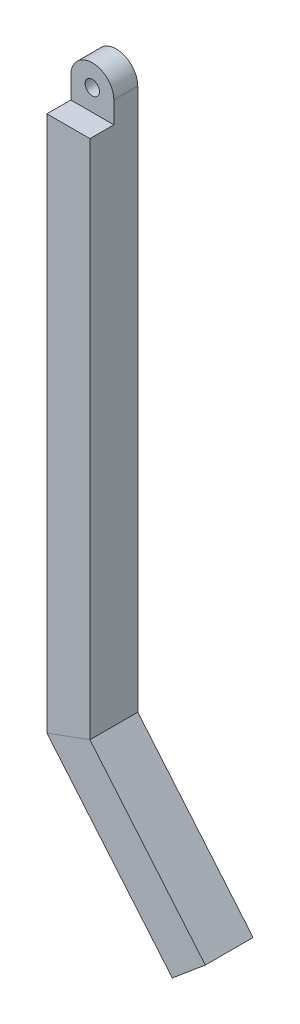
ISO-10303-21;
HEADER;
FILE_DESCRIPTION(('STEP AP214'),'2;1');
FILE_NAME('part.step','',(''),(''),'','','');
FILE_SCHEMA(('AUTOMOTIVE_DESIGN { 1 0 10303 214 1 1 1 1 }'));
ENDSEC;
DATA;
#1=APPLICATION_CONTEXT('core data for automotive mechanical design processes');
#2=APPLICATION_PROTOCOL_DEFINITION('international standard','automotive_design',2000,#1);
#3=PRODUCT_CONTEXT('',#1,'mechanical');
#4=PRODUCT('Part','Part','',(#3));
#5=PRODUCT_RELATED_PRODUCT_CATEGORY('part','',(#4));
#6=PRODUCT_DEFINITION_FORMATION('','',#4);
#7=PRODUCT_DEFINITION_CONTEXT('part definition',#1,'design');
#8=PRODUCT_DEFINITION('design','',#6,#7);
#9=PRODUCT_DEFINITION_SHAPE('','',#8);
#10=(LENGTH_UNIT() NAMED_UNIT(*) SI_UNIT(.MILLI.,.METRE.));
#11=(NAMED_UNIT(*) PLANE_ANGLE_UNIT() SI_UNIT($,.RADIAN.));
#12=(NAMED_UNIT(*) SI_UNIT($,.STERADIAN.) SOLID_ANGLE_UNIT());
#13=UNCERTAINTY_MEASURE_WITH_UNIT(LENGTH_MEASURE(1.E-05),#10,'distance_accuracy_value','');
#14=(GEOMETRIC_REPRESENTATION_CONTEXT(3) GLOBAL_UNCERTAINTY_ASSIGNED_CONTEXT((#13)) GLOBAL_UNIT_ASSIGNED_CONTEXT((#10,
#11,#12)) REPRESENTATION_CONTEXT('',''));
#15=CARTESIAN_POINT('',(0.,0.,0.));
#16=DIRECTION('',(0.,0.,1.));
#17=DIRECTION('',(1.,0.,0.));
#18=AXIS2_PLACEMENT_3D('',#15,#16,#17);
#19=CARTESIAN_POINT('',(-15.3,10.,-1.04285714285714));
#20=DIRECTION('',(-1.,0.,0.));
#21=DIRECTION('',(0.,0.,1.));
#22=AXIS2_PLACEMENT_3D('',#19,#20,#21);
#23=PLANE('',#22);
#24=DIRECTION('',(0.,0.,-1.));
#25=VECTOR('',#24,1.);
#26=CARTESIAN_POINT('',(-15.3,0.5,13.9571428571429));
#27=LINE('',#26,#25);
#28=CARTESIAN_POINT('',(-15.3,0.5,8.95714285714286));
#29=VERTEX_POINT('',#28);
#30=CARTESIAN_POINT('',(-15.3,0.5,3.95714285714286));
#31=VERTEX_POINT('',#30);
#32=EDGE_CURVE('E206',#29,#31,#27,.T.);
#33=ORIENTED_EDGE('',*,*,#32,.F.);
#34=DIRECTION('',(0.,-1.,0.));
#35=VECTOR('',#34,1.);
#36=CARTESIAN_POINT('',(-15.3,10.,8.95714285714286));
#37=LINE('',#36,#35);
#38=CARTESIAN_POINT('',(-15.3,-108.362133945802,8.95714285714286));
#39=VERTEX_POINT('',#38);
#40=EDGE_CURVE('E137',#29,#39,#37,.T.);
#41=ORIENTED_EDGE('',*,*,#40,.T.);
#42=DIRECTION('',(0.,0.,1.));
#43=VECTOR('',#42,1.);
#44=CARTESIAN_POINT('',(-15.3,-108.362133945802,-1.04285714285714));
#45=LINE('',#44,#43);
#46=CARTESIAN_POINT('',(-15.3,-108.362133945802,-1.04285714285714));
#47=VERTEX_POINT('',#46);
#48=EDGE_CURVE('E173',#47,#39,#45,.T.);
#49=ORIENTED_EDGE('',*,*,#48,.F.);
#50=DIRECTION('',(0.,-1.,0.));
#51=VECTOR('',#50,1.);
#52=CARTESIAN_POINT('',(-15.3,10.,-1.04285714285714));
#53=LINE('',#52,#51);
#54=CARTESIAN_POINT('',(-15.3,5.,-1.04285714285714));
#55=VERTEX_POINT('',#54);
#56=EDGE_CURVE('E134',#55,#47,#53,.T.);
#57=ORIENTED_EDGE('',*,*,#56,.F.);
#58=DIRECTION('',(0.,0.,1.));
#59=VECTOR('',#58,1.);
#60=CARTESIAN_POINT('',(-15.3,5.,-1.04285714285714));
#61=LINE('',#60,#59);
#62=CARTESIAN_POINT('',(-15.3,5.,3.95714285714286));
#63=VERTEX_POINT('',#62);
#64=EDGE_CURVE('E62',#55,#63,#61,.T.);
#65=ORIENTED_EDGE('',*,*,#64,.T.);
#66=DIRECTION('',(0.,1.,0.));
#67=VECTOR('',#66,1.);
#68=CARTESIAN_POINT('',(-15.3,0.5,3.95714285714286));
#69=LINE('',#68,#67);
#70=EDGE_CURVE('E55',#31,#63,#69,.T.);
#71=ORIENTED_EDGE('',*,*,#70,.F.);
#72=EDGE_LOOP('',(#33,#41,#49,#57,#65,#71));
#73=FACE_BOUND('',#72,.T.);
#74=ADVANCED_FACE('F39',(#73),#23,.F.);
#75=CARTESIAN_POINT('',(-24.3,10.,8.95714285714286));
#76=DIRECTION('',(1.,0.,0.));
#77=DIRECTION('',(0.,0.,-1.));
#78=AXIS2_PLACEMENT_3D('',#75,#76,#77);
#79=PLANE('',#78);
#80=DIRECTION('',(0.,0.,-1.));
#81=VECTOR('',#80,1.);
#82=CARTESIAN_POINT('',(-24.3,0.5,13.9571428571429));
#83=LINE('',#82,#81);
#84=CARTESIAN_POINT('',(-24.3,0.5,8.95714285714286));
#85=VERTEX_POINT('',#84);
#86=CARTESIAN_POINT('',(-24.3,0.5,3.95714285714286));
#87=VERTEX_POINT('',#86);
#88=EDGE_CURVE('E117',#85,#87,#83,.T.);
#89=ORIENTED_EDGE('',*,*,#88,.T.);
#90=DIRECTION('',(0.,-1.,0.));
#91=VECTOR('',#90,1.);
#92=CARTESIAN_POINT('',(-24.3,4.99999999999997,3.95714285714286));
#93=LINE('',#92,#91);
#94=CARTESIAN_POINT('',(-24.3,4.99999999999997,3.95714285714286));
#95=VERTEX_POINT('',#94);
#96=EDGE_CURVE('E105',#95,#87,#93,.T.);
#97=ORIENTED_EDGE('',*,*,#96,.F.);
#98=DIRECTION('',(0.,0.,1.));
#99=VECTOR('',#98,1.);
#100=CARTESIAN_POINT('',(-24.3,5.,-1.04285714285714));
#101=LINE('',#100,#99);
#102=CARTESIAN_POINT('',(-24.3,5.,-1.04285714285714));
#103=VERTEX_POINT('',#102);
#104=EDGE_CURVE('E114',#103,#95,#101,.T.);
#105=ORIENTED_EDGE('',*,*,#104,.F.);
#106=DIRECTION('',(0.,-1.,0.));
#107=VECTOR('',#106,1.);
#108=CARTESIAN_POINT('',(-24.3,10.,-1.04285714285714));
#109=LINE('',#108,#107);
#110=CARTESIAN_POINT('',(-24.3,-111.637866054198,-1.04285714285714));
#111=VERTEX_POINT('',#110);
#112=EDGE_CURVE('E127',#103,#111,#109,.T.);
#113=ORIENTED_EDGE('',*,*,#112,.T.);
#114=DIRECTION('',(0.,0.,-1.));
#115=VECTOR('',#114,1.);
#116=CARTESIAN_POINT('',(-24.3,-111.637866054198,8.95714285714284));
#117=LINE('',#116,#115);
#118=CARTESIAN_POINT('',(-24.3,-111.637866054198,8.95714285714286));
#119=VERTEX_POINT('',#118);
#120=EDGE_CURVE('E150',#119,#111,#117,.T.);
#121=ORIENTED_EDGE('',*,*,#120,.F.);
#122=DIRECTION('',(0.,-1.,0.));
#123=VECTOR('',#122,1.);
#124=CARTESIAN_POINT('',(-24.3,10.,8.95714285714286));
#125=LINE('',#124,#123);
#126=EDGE_CURVE('E48',#85,#119,#125,.T.);
#127=ORIENTED_EDGE('',*,*,#126,.F.);
#128=EDGE_LOOP('',(#89,#97,#105,#113,#121,#127));
#129=FACE_BOUND('',#128,.T.);
#130=ADVANCED_FACE('F41',(#129),#79,.F.);
#131=CARTESIAN_POINT('',(-15.3,10.,8.95714285714286));
#132=DIRECTION('',(0.,0.,-1.));
#133=DIRECTION('',(-1.,0.,0.));
#134=AXIS2_PLACEMENT_3D('',#131,#132,#133);
#135=PLANE('',#134);
#136=DIRECTION('',(1.,0.,0.));
#137=VECTOR('',#136,1.);
#138=CARTESIAN_POINT('',(-15.3,0.5,8.95714285714286));
#139=LINE('',#138,#137);
#140=EDGE_CURVE('E11',#85,#29,#139,.T.);
#141=ORIENTED_EDGE('',*,*,#140,.F.);
#142=ORIENTED_EDGE('',*,*,#126,.T.);
#143=DIRECTION('',(-0.939692620785908,-0.342020143325669,0.));
#144=VECTOR('',#143,1.);
#145=CARTESIAN_POINT('',(19.5269185297774,-95.686172249749,8.95714285714286));
#146=LINE('',#145,#144);
#147=EDGE_CURVE('E147',#39,#119,#146,.T.);
#148=ORIENTED_EDGE('',*,*,#147,.F.);
#149=ORIENTED_EDGE('',*,*,#40,.F.);
#150=EDGE_LOOP('',(#141,#142,#148,#149));
#151=FACE_BOUND('',#150,.T.);
#152=ADVANCED_FACE('F144',(#151),#135,.F.);
#153=CARTESIAN_POINT('',(-24.3,10.,-1.04285714285714));
#154=DIRECTION('',(0.,0.,1.));
#155=DIRECTION('',(1.,0.,0.));
#156=AXIS2_PLACEMENT_3D('',#153,#154,#155);
#157=PLANE('',#156);
#158=CARTESIAN_POINT('',(-19.8,4.99999999999998,-1.04285714285714));
#159=DIRECTION('',(0.,0.,1.));
#160=DIRECTION('',(1.,0.,0.));
#161=AXIS2_PLACEMENT_3D('',#158,#159,#160);
#162=CIRCLE('',#161,1.5);
#163=CARTESIAN_POINT('',(-18.3,4.99999999999998,-1.04285714285714));
#164=VERTEX_POINT('',#163);
#165=EDGE_CURVE('E109',#164,#164,#162,.T.);
#166=ORIENTED_EDGE('',*,*,#165,.T.);
#167=EDGE_LOOP('',(#166));
#168=FACE_BOUND('',#167,.T.);
#169=ORIENTED_EDGE('',*,*,#112,.F.);
#170=CARTESIAN_POINT('',(-19.8,5.,-1.04285714285714));
#171=DIRECTION('',(0.,0.,-1.));
#172=DIRECTION('',(-1.,0.,0.));
#173=AXIS2_PLACEMENT_3D('',#170,#171,#172);
#174=CIRCLE('',#173,4.5);
#175=EDGE_CURVE('E122',#103,#55,#174,.T.);
#176=ORIENTED_EDGE('',*,*,#175,.T.);
#177=ORIENTED_EDGE('',*,*,#56,.T.);
#178=DIRECTION('',(0.939692620785908,0.342020143325669,0.));
#179=VECTOR('',#178,1.);
#180=CARTESIAN_POINT('',(11.579718535742,-98.5787164933384,-1.04285714285714));
#181=LINE('',#180,#179);
#182=EDGE_CURVE('E129',#111,#47,#181,.T.);
#183=ORIENTED_EDGE('',*,*,#182,.F.);
#184=EDGE_LOOP('',(#169,#176,#177,#183));
#185=FACE_BOUND('',#184,.T.);
#186=ADVANCED_FACE('F220',(#168,#185),#157,.F.);
#187=CARTESIAN_POINT('',(-19.8,5.,-1.04285714285714));
#188=DIRECTION('',(0.,0.,1.));
#189=DIRECTION('',(1.,0.,0.));
#190=AXIS2_PLACEMENT_3D('',#187,#188,#189);
#191=CYLINDRICAL_SURFACE('',#190,4.5);
#192=ORIENTED_EDGE('',*,*,#104,.T.);
#193=CARTESIAN_POINT('',(-19.8,4.99999999999998,3.95714285714286));
#194=DIRECTION('',(0.,0.,1.));
#195=DIRECTION('',(-1.,0.,0.));
#196=AXIS2_PLACEMENT_3D('',#193,#194,#195);
#197=CIRCLE('',#196,4.5);
#198=EDGE_CURVE('E102',#63,#95,#197,.T.);
#199=ORIENTED_EDGE('',*,*,#198,.F.);
#200=ORIENTED_EDGE('',*,*,#64,.F.);
#201=ORIENTED_EDGE('',*,*,#175,.F.);
#202=EDGE_LOOP('',(#192,#199,#200,#201));
#203=FACE_BOUND('',#202,.T.);
#204=ADVANCED_FACE('F121',(#203),#191,.T.);
#205=CARTESIAN_POINT('',(20.5406689090742,-127.272805328207,0.));
#206=DIRECTION('',(0.64278760968654,-0.766044443118977,0.));
#207=DIRECTION('',(0.,0.,-1.));
#208=AXIS2_PLACEMENT_3D('',#205,#206,#207);
#209=PLANE('',#208);
#210=DIRECTION('',(0.,0.,1.));
#211=VECTOR('',#210,1.);
#212=CARTESIAN_POINT('',(1.92578894128309,-142.892544243589,8.95714285714286));
#213=LINE('',#212,#211);
#214=CARTESIAN_POINT('',(1.9257889412831,-142.892544243589,-1.04285714285714));
#215=VERTEX_POINT('',#214);
#216=CARTESIAN_POINT('',(1.92578894128309,-142.892544243589,8.95714285714286));
#217=VERTEX_POINT('',#216);
#218=EDGE_CURVE('E161',#215,#217,#213,.T.);
#219=ORIENTED_EDGE('',*,*,#218,.F.);
#220=DIRECTION('',(-0.766044443118977,-0.64278760968654,0.));
#221=VECTOR('',#220,1.);
#222=CARTESIAN_POINT('',(1.9257889412831,-142.892544243589,-1.04285714285714));
#223=LINE('',#222,#221);
#224=CARTESIAN_POINT('',(8.82018892935388,-137.107455756411,-1.04285714285714));
#225=VERTEX_POINT('',#224);
#226=EDGE_CURVE('E184',#225,#215,#223,.T.);
#227=ORIENTED_EDGE('',*,*,#226,.F.);
#228=DIRECTION('',(0.,0.,-1.));
#229=VECTOR('',#228,1.);
#230=CARTESIAN_POINT('',(8.82018892935389,-137.107455756411,-1.04285714285714));
#231=LINE('',#230,#229);
#232=CARTESIAN_POINT('',(8.82018892935388,-137.107455756411,8.95714285714286));
#233=VERTEX_POINT('',#232);
#234=EDGE_CURVE('E166',#233,#225,#231,.T.);
#235=ORIENTED_EDGE('',*,*,#234,.F.);
#236=DIRECTION('',(0.766044443118977,0.64278760968654,0.));
#237=VECTOR('',#236,1.);
#238=CARTESIAN_POINT('',(8.82018892935389,-137.107455756411,8.95714285714286));
#239=LINE('',#238,#237);
#240=EDGE_CURVE('E179',#217,#233,#239,.T.);
#241=ORIENTED_EDGE('',*,*,#240,.F.);
#242=EDGE_LOOP('',(#219,#227,#235,#241));
#243=FACE_BOUND('',#242,.T.);
#244=ADVANCED_FACE('F228',(#243),#209,.T.);
#245=CARTESIAN_POINT('',(-17.5751587734943,-105.650705303768,-1.04285714285714));
#246=DIRECTION('',(-0.766044443118977,-0.64278760968654,0.));
#247=DIRECTION('',(0.64278760968654,-0.766044443118977,0.));
#248=AXIS2_PLACEMENT_3D('',#245,#246,#247);
#249=PLANE('',#248);
#250=ORIENTED_EDGE('',*,*,#48,.T.);
#251=DIRECTION('',(0.64278760968654,-0.766044443118977,0.));
#252=VECTOR('',#251,1.);
#253=CARTESIAN_POINT('',(-17.5751587734943,-105.650705303768,8.95714285714286));
#254=LINE('',#253,#252);
#255=EDGE_CURVE('E170',#39,#233,#254,.T.);
#256=ORIENTED_EDGE('',*,*,#255,.T.);
#257=ORIENTED_EDGE('',*,*,#234,.T.);
#258=DIRECTION('',(0.64278760968654,-0.766044443118977,0.));
#259=VECTOR('',#258,1.);
#260=CARTESIAN_POINT('',(-17.5751587734943,-105.650705303768,-1.04285714285714));
#261=LINE('',#260,#259);
#262=EDGE_CURVE('E191',#47,#225,#261,.T.);
#263=ORIENTED_EDGE('',*,*,#262,.F.);
#264=EDGE_LOOP('',(#250,#256,#257,#263));
#265=FACE_BOUND('',#264,.T.);
#266=ADVANCED_FACE('F197',(#265),#249,.F.);
#267=CARTESIAN_POINT('',(-24.4695587615651,-111.435793790947,-1.04285714285714));
#268=DIRECTION('',(0.,0.,1.));
#269=DIRECTION('',(1.,0.,0.));
#270=AXIS2_PLACEMENT_3D('',#267,#268,#269);
#271=PLANE('',#270);
#272=ORIENTED_EDGE('',*,*,#182,.T.);
#273=ORIENTED_EDGE('',*,*,#262,.T.);
#274=ORIENTED_EDGE('',*,*,#226,.T.);
#275=DIRECTION('',(0.64278760968654,-0.766044443118977,0.));
#276=VECTOR('',#275,1.);
#277=CARTESIAN_POINT('',(-24.4695587615651,-111.435793790947,-1.04285714285714));
#278=LINE('',#277,#276);
#279=EDGE_CURVE('E165',#111,#215,#278,.T.);
#280=ORIENTED_EDGE('',*,*,#279,.F.);
#281=EDGE_LOOP('',(#272,#273,#274,#280));
#282=FACE_BOUND('',#281,.T.);
#283=ADVANCED_FACE('F218',(#282),#271,.F.);
#284=CARTESIAN_POINT('',(-24.4695587615651,-111.435793790947,8.95714285714286));
#285=DIRECTION('',(0.766044443118977,0.64278760968654,0.));
#286=DIRECTION('',(-0.64278760968654,0.766044443118977,0.));
#287=AXIS2_PLACEMENT_3D('',#284,#285,#286);
#288=PLANE('',#287);
#289=ORIENTED_EDGE('',*,*,#120,.T.);
#290=ORIENTED_EDGE('',*,*,#279,.T.);
#291=ORIENTED_EDGE('',*,*,#218,.T.);
#292=DIRECTION('',(0.64278760968654,-0.766044443118977,0.));
#293=VECTOR('',#292,1.);
#294=CARTESIAN_POINT('',(-24.4695587615651,-111.435793790947,8.95714285714286));
#295=LINE('',#294,#293);
#296=EDGE_CURVE('E158',#119,#217,#295,.T.);
#297=ORIENTED_EDGE('',*,*,#296,.F.);
#298=EDGE_LOOP('',(#289,#290,#291,#297));
#299=FACE_BOUND('',#298,.T.);
#300=ADVANCED_FACE('F159',(#299),#288,.F.);
#301=CARTESIAN_POINT('',(-17.5751587734943,-105.650705303768,8.95714285714286));
#302=DIRECTION('',(0.,0.,-1.));
#303=DIRECTION('',(-1.,0.,0.));
#304=AXIS2_PLACEMENT_3D('',#301,#302,#303);
#305=PLANE('',#304);
#306=ORIENTED_EDGE('',*,*,#147,.T.);
#307=ORIENTED_EDGE('',*,*,#296,.T.);
#308=ORIENTED_EDGE('',*,*,#240,.T.);
#309=ORIENTED_EDGE('',*,*,#255,.F.);
#310=EDGE_LOOP('',(#306,#307,#308,#309));
#311=FACE_BOUND('',#310,.T.);
#312=ADVANCED_FACE('F168',(#311),#305,.F.);
#313=CARTESIAN_POINT('',(-24.3,0.5,13.9571428571429));
#314=DIRECTION('',(0.,1.,0.));
#315=DIRECTION('',(0.,0.,1.));
#316=AXIS2_PLACEMENT_3D('',#313,#314,#315);
#317=PLANE('',#316);
#318=ORIENTED_EDGE('',*,*,#140,.T.);
#319=ORIENTED_EDGE('',*,*,#32,.T.);
#320=DIRECTION('',(1.,0.,0.));
#321=VECTOR('',#320,1.);
#322=CARTESIAN_POINT('',(-24.3,0.5,3.95714285714286));
#323=LINE('',#322,#321);
#324=EDGE_CURVE('E119',#87,#31,#323,.T.);
#325=ORIENTED_EDGE('',*,*,#324,.F.);
#326=ORIENTED_EDGE('',*,*,#88,.F.);
#327=EDGE_LOOP('',(#318,#319,#325,#326));
#328=FACE_BOUND('',#327,.T.);
#329=ADVANCED_FACE('F258',(#328),#317,.T.);
#330=CARTESIAN_POINT('',(-19.8,4.99999999999998,3.95714285714286));
#331=DIRECTION('',(0.,0.,-1.));
#332=DIRECTION('',(-1.,0.,0.));
#333=AXIS2_PLACEMENT_3D('',#330,#331,#332);
#334=PLANE('',#333);
#335=CARTESIAN_POINT('',(-19.8,4.99999999999998,3.95714285714286));
#336=DIRECTION('',(0.,0.,1.));
#337=DIRECTION('',(1.,0.,0.));
#338=AXIS2_PLACEMENT_3D('',#335,#336,#337);
#339=CIRCLE('',#338,1.5);
#340=CARTESIAN_POINT('',(-18.3,4.99999999999998,3.95714285714286));
#341=VERTEX_POINT('',#340);
#342=EDGE_CURVE('E344',#341,#341,#339,.T.);
#343=ORIENTED_EDGE('',*,*,#342,.F.);
#344=EDGE_LOOP('',(#343));
#345=FACE_BOUND('',#344,.T.);
#346=ORIENTED_EDGE('',*,*,#198,.T.);
#347=ORIENTED_EDGE('',*,*,#96,.T.);
#348=ORIENTED_EDGE('',*,*,#324,.T.);
#349=ORIENTED_EDGE('',*,*,#70,.T.);
#350=EDGE_LOOP('',(#346,#347,#348,#349));
#351=FACE_BOUND('',#350,.T.);
#352=ADVANCED_FACE('F104',(#345,#351),#334,.F.);
#353=CARTESIAN_POINT('',(-19.8,4.99999999999998,-6.04285714285714));
#354=DIRECTION('',(0.,0.,1.));
#355=DIRECTION('',(1.,0.,0.));
#356=AXIS2_PLACEMENT_3D('',#353,#354,#355);
#357=CYLINDRICAL_SURFACE('',#356,1.5);
#358=ORIENTED_EDGE('',*,*,#342,.T.);
#359=EDGE_LOOP('',(#358));
#360=FACE_BOUND('',#359,.T.);
#361=ORIENTED_EDGE('',*,*,#165,.F.);
#362=EDGE_LOOP('',(#361));
#363=FACE_BOUND('',#362,.T.);
#364=ADVANCED_FACE('F277',(#360,#363),#357,.F.);
#365=CLOSED_SHELL('',(#74,#130,#152,#186,#204,#244,#266,#283,#300,#312,#329,#352,#364));
#366=MANIFOLD_SOLID_BREP('B2',#365);
#367=ADVANCED_BREP_SHAPE_REPRESENTATION('',(#18,#366),#14);
#368=SHAPE_DEFINITION_REPRESENTATION(#9,#367);
ENDSEC;
END-ISO-10303-21;
